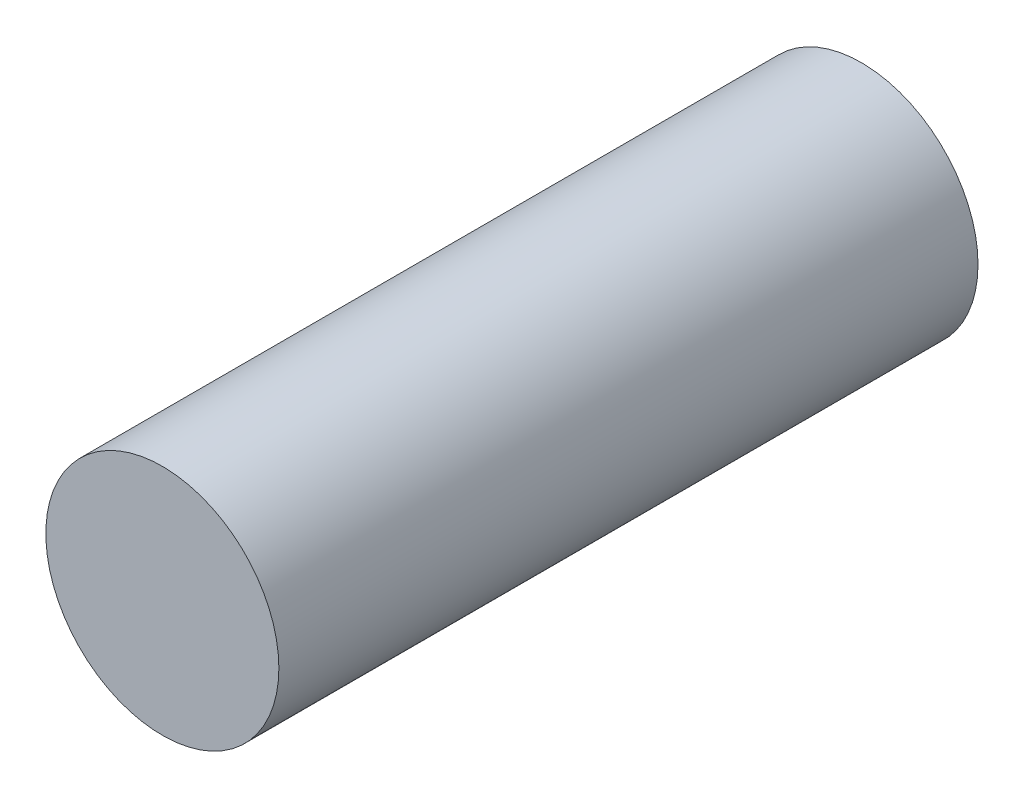
ISO-10303-21;
HEADER;
FILE_DESCRIPTION(('STEP AP214'),'2;1');
FILE_NAME('part.step','',(''),(''),'','','');
FILE_SCHEMA(('AUTOMOTIVE_DESIGN { 1 0 10303 214 1 1 1 1 }'));
ENDSEC;
DATA;
#1=APPLICATION_CONTEXT('core data for automotive mechanical design processes');
#2=APPLICATION_PROTOCOL_DEFINITION('international standard','automotive_design',2000,#1);
#3=PRODUCT_CONTEXT('',#1,'mechanical');
#4=PRODUCT('Part','Part','',(#3));
#5=PRODUCT_RELATED_PRODUCT_CATEGORY('part','',(#4));
#6=PRODUCT_DEFINITION_FORMATION('','',#4);
#7=PRODUCT_DEFINITION_CONTEXT('part definition',#1,'design');
#8=PRODUCT_DEFINITION('design','',#6,#7);
#9=PRODUCT_DEFINITION_SHAPE('','',#8);
#10=(LENGTH_UNIT() NAMED_UNIT(*) SI_UNIT(.MILLI.,.METRE.));
#11=(NAMED_UNIT(*) PLANE_ANGLE_UNIT() SI_UNIT($,.RADIAN.));
#12=(NAMED_UNIT(*) SI_UNIT($,.STERADIAN.) SOLID_ANGLE_UNIT());
#13=UNCERTAINTY_MEASURE_WITH_UNIT(LENGTH_MEASURE(1.E-05),#10,'distance_accuracy_value','');
#14=(GEOMETRIC_REPRESENTATION_CONTEXT(3) GLOBAL_UNCERTAINTY_ASSIGNED_CONTEXT((#13)) GLOBAL_UNIT_ASSIGNED_CONTEXT((#10,
#11,#12)) REPRESENTATION_CONTEXT('',''));
#15=CARTESIAN_POINT('',(0.,0.,0.));
#16=DIRECTION('',(0.,0.,1.));
#17=DIRECTION('',(1.,0.,0.));
#18=AXIS2_PLACEMENT_3D('',#15,#16,#17);
#19=CARTESIAN_POINT('',(-42.5017350506364,-93.7828490657711,-44.1421356237332));
#20=DIRECTION('',(0.,0.,1.));
#21=DIRECTION('',(1.,0.,0.));
#22=AXIS2_PLACEMENT_3D('',#19,#20,#21);
#23=CYLINDRICAL_SURFACE('',#22,5.00000000000001);
#24=CARTESIAN_POINT('',(-42.5017350506364,-93.7828490657711,-30.0000000000022));
#25=DIRECTION('',(0.,0.,1.));
#26=DIRECTION('',(1.,0.,0.));
#27=AXIS2_PLACEMENT_3D('',#24,#25,#26);
#28=CIRCLE('',#27,5.00000000000001);
#29=CARTESIAN_POINT('',(-37.5017350506364,-93.7828490657711,-30.0000000000022));
#30=VERTEX_POINT('',#29);
#31=EDGE_CURVE('E12',#30,#30,#28,.F.);
#32=ORIENTED_EDGE('',*,*,#31,.F.);
#33=EDGE_LOOP('',(#32));
#34=FACE_BOUND('',#33,.T.);
#35=CARTESIAN_POINT('',(-42.5017350506364,-93.7828490657711,0.));
#36=DIRECTION('',(0.,0.,1.));
#37=DIRECTION('',(1.,0.,0.));
#38=AXIS2_PLACEMENT_3D('',#35,#36,#37);
#39=CIRCLE('',#38,5.00000000000001);
#40=CARTESIAN_POINT('',(-37.5017350506364,-93.7828490657711,0.));
#41=VERTEX_POINT('',#40);
#42=EDGE_CURVE('E53',#41,#41,#39,.T.);
#43=ORIENTED_EDGE('',*,*,#42,.F.);
#44=EDGE_LOOP('',(#43));
#45=FACE_BOUND('',#44,.T.);
#46=ADVANCED_FACE('F47',(#34,#45),#23,.T.);
#47=CARTESIAN_POINT('',(-42.5017350506364,-93.7828490657711,0.));
#48=DIRECTION('',(0.,0.,1.));
#49=DIRECTION('',(1.,0.,0.));
#50=AXIS2_PLACEMENT_3D('',#47,#48,#49);
#51=PLANE('',#50);
#52=ORIENTED_EDGE('',*,*,#42,.T.);
#53=EDGE_LOOP('',(#52));
#54=FACE_BOUND('',#53,.T.);
#55=ADVANCED_FACE('F59',(#54),#51,.T.);
#56=CARTESIAN_POINT('',(48.0540199204175,-63.0001577968242,-30.0000000000033));
#57=DIRECTION('',(0.,0.,1.));
#58=DIRECTION('',(0.870322748281121,0.492481790348025,0.));
#59=AXIS2_PLACEMENT_3D('',#56,#57,#58);
#60=PLANE('',#59);
#61=ORIENTED_EDGE('',*,*,#31,.T.);
#62=EDGE_LOOP('',(#61));
#63=FACE_BOUND('',#62,.T.);
#64=ADVANCED_FACE('F66',(#63),#60,.F.);
#65=CLOSED_SHELL('',(#46,#55,#64));
#66=MANIFOLD_SOLID_BREP('B2',#65);
#67=ADVANCED_BREP_SHAPE_REPRESENTATION('',(#18,#66),#14);
#68=SHAPE_DEFINITION_REPRESENTATION(#9,#67);
ENDSEC;
END-ISO-10303-21;
